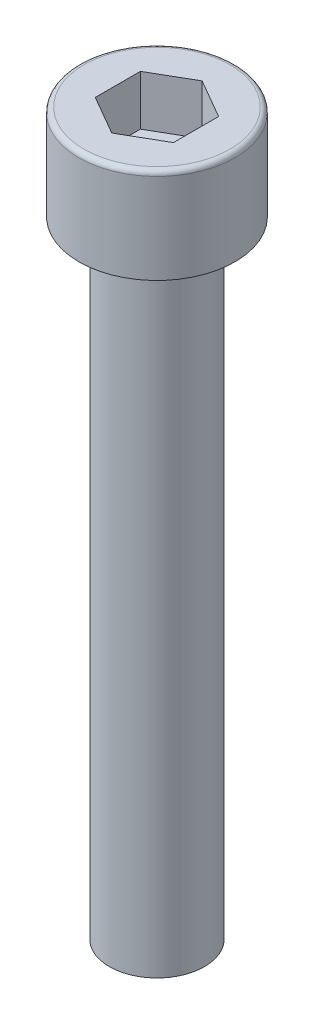
ISO-10303-21;
HEADER;
FILE_DESCRIPTION(('STEP AP214'),'2;1');
FILE_NAME('part.step','',(''),(''),'','','');
FILE_SCHEMA(('AUTOMOTIVE_DESIGN { 1 0 10303 214 1 1 1 1 }'));
ENDSEC;
DATA;
#1=APPLICATION_CONTEXT('core data for automotive mechanical design processes');
#2=APPLICATION_PROTOCOL_DEFINITION('international standard','automotive_design',2000,#1);
#3=PRODUCT_CONTEXT('',#1,'mechanical');
#4=PRODUCT('Part','Part','',(#3));
#5=PRODUCT_RELATED_PRODUCT_CATEGORY('part','',(#4));
#6=PRODUCT_DEFINITION_FORMATION('','',#4);
#7=PRODUCT_DEFINITION_CONTEXT('part definition',#1,'design');
#8=PRODUCT_DEFINITION('design','',#6,#7);
#9=PRODUCT_DEFINITION_SHAPE('','',#8);
#10=(LENGTH_UNIT() NAMED_UNIT(*) SI_UNIT(.MILLI.,.METRE.));
#11=(NAMED_UNIT(*) PLANE_ANGLE_UNIT() SI_UNIT($,.RADIAN.));
#12=(NAMED_UNIT(*) SI_UNIT($,.STERADIAN.) SOLID_ANGLE_UNIT());
#13=UNCERTAINTY_MEASURE_WITH_UNIT(LENGTH_MEASURE(1.E-05),#10,'distance_accuracy_value','');
#14=(GEOMETRIC_REPRESENTATION_CONTEXT(3) GLOBAL_UNCERTAINTY_ASSIGNED_CONTEXT((#13)) GLOBAL_UNIT_ASSIGNED_CONTEXT((#10,
#11,#12)) REPRESENTATION_CONTEXT('',''));
#15=CARTESIAN_POINT('',(0.,0.,0.));
#16=DIRECTION('',(0.,0.,1.));
#17=DIRECTION('',(1.,0.,0.));
#18=AXIS2_PLACEMENT_3D('',#15,#16,#17);
#19=CARTESIAN_POINT('',(0.,-31.75,0.));
#20=DIRECTION('',(0.,1.,0.));
#21=DIRECTION('',(0.,0.,1.));
#22=AXIS2_PLACEMENT_3D('',#19,#20,#21);
#23=CYLINDRICAL_SURFACE('',#22,2.413);
#24=CARTESIAN_POINT('',(0.,-31.75,0.));
#25=DIRECTION('',(0.,1.,0.));
#26=DIRECTION('',(0.,0.,1.));
#27=AXIS2_PLACEMENT_3D('',#24,#25,#26);
#28=CIRCLE('',#27,2.413);
#29=CARTESIAN_POINT('',(0.,-31.75,2.413));
#30=VERTEX_POINT('',#29);
#31=EDGE_CURVE('E146',#30,#30,#28,.T.);
#32=ORIENTED_EDGE('',*,*,#31,.T.);
#33=EDGE_LOOP('',(#32));
#34=FACE_BOUND('',#33,.T.);
#35=CARTESIAN_POINT('',(0.,0.,0.));
#36=DIRECTION('',(0.,1.,0.));
#37=DIRECTION('',(0.,0.,1.));
#38=AXIS2_PLACEMENT_3D('',#35,#36,#37);
#39=CIRCLE('',#38,2.413);
#40=CARTESIAN_POINT('',(0.,0.,2.413));
#41=VERTEX_POINT('',#40);
#42=EDGE_CURVE('E145',#41,#41,#39,.T.);
#43=ORIENTED_EDGE('',*,*,#42,.F.);
#44=EDGE_LOOP('',(#43));
#45=FACE_BOUND('',#44,.T.);
#46=ADVANCED_FACE('F35',(#34,#45),#23,.T.);
#47=CARTESIAN_POINT('',(0.,-31.75,0.));
#48=DIRECTION('',(0.,1.,0.));
#49=DIRECTION('',(0.,0.,1.));
#50=AXIS2_PLACEMENT_3D('',#47,#48,#49);
#51=PLANE('',#50);
#52=ORIENTED_EDGE('',*,*,#31,.F.);
#53=EDGE_LOOP('',(#52));
#54=FACE_BOUND('',#53,.T.);
#55=ADVANCED_FACE('F169',(#54),#51,.F.);
#56=CARTESIAN_POINT('',(0.,4.826,0.));
#57=DIRECTION('',(0.,-1.,0.));
#58=DIRECTION('',(0.,0.,-1.));
#59=AXIS2_PLACEMENT_3D('',#56,#57,#58);
#60=CYLINDRICAL_SURFACE('',#59,3.9624);
#61=CARTESIAN_POINT('',(0.,4.572,0.));
#62=DIRECTION('',(0.,1.,0.));
#63=DIRECTION('',(0.,0.,1.));
#64=AXIS2_PLACEMENT_3D('',#61,#62,#63);
#65=CIRCLE('',#64,3.9624);
#66=CARTESIAN_POINT('',(0.,4.572,3.9624));
#67=VERTEX_POINT('',#66);
#68=EDGE_CURVE('E11',#67,#67,#65,.F.);
#69=ORIENTED_EDGE('',*,*,#68,.T.);
#70=EDGE_LOOP('',(#69));
#71=FACE_BOUND('',#70,.T.);
#72=CARTESIAN_POINT('',(0.,0.,0.));
#73=DIRECTION('',(0.,1.,0.));
#74=DIRECTION('',(0.,0.,1.));
#75=AXIS2_PLACEMENT_3D('',#72,#73,#74);
#76=CIRCLE('',#75,3.9624);
#77=CARTESIAN_POINT('',(0.,0.,3.9624));
#78=VERTEX_POINT('',#77);
#79=EDGE_CURVE('E137',#78,#78,#76,.T.);
#80=ORIENTED_EDGE('',*,*,#79,.T.);
#81=EDGE_LOOP('',(#80));
#82=FACE_BOUND('',#81,.T.);
#83=ADVANCED_FACE('F174',(#71,#82),#60,.T.);
#84=CARTESIAN_POINT('',(0.,4.826,0.));
#85=DIRECTION('',(0.,1.,0.));
#86=DIRECTION('',(0.,0.,1.));
#87=AXIS2_PLACEMENT_3D('',#84,#85,#86);
#88=PLANE('',#87);
#89=DIRECTION('',(-0.866025403784439,0.,-0.5));
#90=VECTOR('',#89,1.);
#91=CARTESIAN_POINT('',(1.984375,4.826,-1.14567944042316));
#92=LINE('',#91,#90);
#93=CARTESIAN_POINT('',(1.984375,4.826,-1.14567944042316));
#94=VERTEX_POINT('',#93);
#95=CARTESIAN_POINT('',(0.,4.826,-2.29135888084633));
#96=VERTEX_POINT('',#95);
#97=EDGE_CURVE('E50',#94,#96,#92,.T.);
#98=ORIENTED_EDGE('',*,*,#97,.F.);
#99=DIRECTION('',(0.,0.,-1.));
#100=VECTOR('',#99,1.);
#101=CARTESIAN_POINT('',(1.984375,4.826,1.14567944042316));
#102=LINE('',#101,#100);
#103=CARTESIAN_POINT('',(1.984375,4.826,1.14567944042316));
#104=VERTEX_POINT('',#103);
#105=EDGE_CURVE('E133',#104,#94,#102,.T.);
#106=ORIENTED_EDGE('',*,*,#105,.F.);
#107=DIRECTION('',(0.866025403784439,0.,-0.5));
#108=VECTOR('',#107,1.);
#109=CARTESIAN_POINT('',(0.,4.826,2.29135888084633));
#110=LINE('',#109,#108);
#111=CARTESIAN_POINT('',(0.,4.826,2.29135888084633));
#112=VERTEX_POINT('',#111);
#113=EDGE_CURVE('E131',#112,#104,#110,.T.);
#114=ORIENTED_EDGE('',*,*,#113,.F.);
#115=DIRECTION('',(0.866025403784439,0.,0.5));
#116=VECTOR('',#115,1.);
#117=CARTESIAN_POINT('',(-1.984375,4.826,1.14567944042316));
#118=LINE('',#117,#116);
#119=CARTESIAN_POINT('',(-1.984375,4.826,1.14567944042316));
#120=VERTEX_POINT('',#119);
#121=EDGE_CURVE('E98',#120,#112,#118,.T.);
#122=ORIENTED_EDGE('',*,*,#121,.F.);
#123=DIRECTION('',(0.,0.,1.));
#124=VECTOR('',#123,1.);
#125=CARTESIAN_POINT('',(-1.984375,4.826,-1.14567944042316));
#126=LINE('',#125,#124);
#127=CARTESIAN_POINT('',(-1.984375,4.826,-1.14567944042316));
#128=VERTEX_POINT('',#127);
#129=EDGE_CURVE('E127',#128,#120,#126,.T.);
#130=ORIENTED_EDGE('',*,*,#129,.F.);
#131=DIRECTION('',(-0.866025403784439,0.,0.5));
#132=VECTOR('',#131,1.);
#133=CARTESIAN_POINT('',(0.,4.826,-2.29135888084633));
#134=LINE('',#133,#132);
#135=EDGE_CURVE('E124',#96,#128,#134,.T.);
#136=ORIENTED_EDGE('',*,*,#135,.F.);
#137=EDGE_LOOP('',(#98,#106,#114,#122,#130,#136));
#138=FACE_BOUND('',#137,.T.);
#139=CARTESIAN_POINT('',(0.,4.826,0.));
#140=DIRECTION('',(0.,1.,0.));
#141=DIRECTION('',(0.,0.,1.));
#142=AXIS2_PLACEMENT_3D('',#139,#140,#141);
#143=CIRCLE('',#142,3.7084);
#144=CARTESIAN_POINT('',(0.,4.826,3.7084));
#145=VERTEX_POINT('',#144);
#146=EDGE_CURVE('E43',#145,#145,#143,.T.);
#147=ORIENTED_EDGE('',*,*,#146,.T.);
#148=EDGE_LOOP('',(#147));
#149=FACE_BOUND('',#148,.T.);
#150=ADVANCED_FACE('F153',(#138,#149),#88,.T.);
#151=CARTESIAN_POINT('',(0.,0.,0.));
#152=DIRECTION('',(0.,1.,0.));
#153=DIRECTION('',(0.,0.,1.));
#154=AXIS2_PLACEMENT_3D('',#151,#152,#153);
#155=PLANE('',#154);
#156=ORIENTED_EDGE('',*,*,#42,.T.);
#157=EDGE_LOOP('',(#156));
#158=FACE_BOUND('',#157,.T.);
#159=ORIENTED_EDGE('',*,*,#79,.F.);
#160=EDGE_LOOP('',(#159));
#161=FACE_BOUND('',#160,.T.);
#162=ADVANCED_FACE('F157',(#158,#161),#155,.F.);
#163=CARTESIAN_POINT('',(0.,4.572,0.));
#164=DIRECTION('',(0.,1.,0.));
#165=DIRECTION('',(0.,0.,1.));
#166=AXIS2_PLACEMENT_3D('',#163,#164,#165);
#167=TOROIDAL_SURFACE('',#166,3.7084,0.254);
#168=ORIENTED_EDGE('',*,*,#68,.F.);
#169=EDGE_LOOP('',(#168));
#170=FACE_BOUND('',#169,.T.);
#171=ORIENTED_EDGE('',*,*,#146,.F.);
#172=EDGE_LOOP('',(#171));
#173=FACE_BOUND('',#172,.T.);
#174=ADVANCED_FACE('F37',(#170,#173),#167,.T.);
#175=CARTESIAN_POINT('',(1.984375,2.286,-1.14567944042316));
#176=DIRECTION('',(0.5,0.,-0.866025403784439));
#177=DIRECTION('',(-0.866025403784439,0.,-0.5));
#178=AXIS2_PLACEMENT_3D('',#175,#176,#177);
#179=PLANE('',#178);
#180=ORIENTED_EDGE('',*,*,#97,.T.);
#181=DIRECTION('',(0.,1.,0.));
#182=VECTOR('',#181,1.);
#183=CARTESIAN_POINT('',(0.,2.286,-2.29135888084633));
#184=LINE('',#183,#182);
#185=CARTESIAN_POINT('',(0.,2.286,-2.29135888084633));
#186=VERTEX_POINT('',#185);
#187=EDGE_CURVE('E80',#186,#96,#184,.T.);
#188=ORIENTED_EDGE('',*,*,#187,.F.);
#189=DIRECTION('',(-0.866025403784439,0.,-0.5));
#190=VECTOR('',#189,1.);
#191=CARTESIAN_POINT('',(1.984375,2.286,-1.14567944042316));
#192=LINE('',#191,#190);
#193=CARTESIAN_POINT('',(1.984375,2.286,-1.14567944042316));
#194=VERTEX_POINT('',#193);
#195=EDGE_CURVE('E135',#194,#186,#192,.T.);
#196=ORIENTED_EDGE('',*,*,#195,.F.);
#197=DIRECTION('',(0.,1.,0.));
#198=VECTOR('',#197,1.);
#199=CARTESIAN_POINT('',(1.984375,2.286,-1.14567944042316));
#200=LINE('',#199,#198);
#201=EDGE_CURVE('E58',#194,#94,#200,.T.);
#202=ORIENTED_EDGE('',*,*,#201,.T.);
#203=EDGE_LOOP('',(#180,#188,#196,#202));
#204=FACE_BOUND('',#203,.T.);
#205=ADVANCED_FACE('F156',(#204),#179,.F.);
#206=CARTESIAN_POINT('',(1.984375,2.286,1.14567944042316));
#207=DIRECTION('',(1.,0.,0.));
#208=DIRECTION('',(0.,0.,-1.));
#209=AXIS2_PLACEMENT_3D('',#206,#207,#208);
#210=PLANE('',#209);
#211=ORIENTED_EDGE('',*,*,#105,.T.);
#212=ORIENTED_EDGE('',*,*,#201,.F.);
#213=DIRECTION('',(0.,0.,-1.));
#214=VECTOR('',#213,1.);
#215=CARTESIAN_POINT('',(1.984375,2.286,1.14567944042316));
#216=LINE('',#215,#214);
#217=CARTESIAN_POINT('',(1.984375,2.286,1.14567944042316));
#218=VERTEX_POINT('',#217);
#219=EDGE_CURVE('E110',#218,#194,#216,.T.);
#220=ORIENTED_EDGE('',*,*,#219,.F.);
#221=DIRECTION('',(0.,1.,0.));
#222=VECTOR('',#221,1.);
#223=CARTESIAN_POINT('',(1.984375,2.286,1.14567944042316));
#224=LINE('',#223,#222);
#225=EDGE_CURVE('E102',#218,#104,#224,.T.);
#226=ORIENTED_EDGE('',*,*,#225,.T.);
#227=EDGE_LOOP('',(#211,#212,#220,#226));
#228=FACE_BOUND('',#227,.T.);
#229=ADVANCED_FACE('F163',(#228),#210,.F.);
#230=CARTESIAN_POINT('',(0.,2.286,2.29135888084633));
#231=DIRECTION('',(0.5,0.,0.866025403784439));
#232=DIRECTION('',(0.866025403784439,0.,-0.5));
#233=AXIS2_PLACEMENT_3D('',#230,#231,#232);
#234=PLANE('',#233);
#235=ORIENTED_EDGE('',*,*,#113,.T.);
#236=ORIENTED_EDGE('',*,*,#225,.F.);
#237=DIRECTION('',(0.866025403784439,0.,-0.5));
#238=VECTOR('',#237,1.);
#239=CARTESIAN_POINT('',(0.,2.286,2.29135888084633));
#240=LINE('',#239,#238);
#241=CARTESIAN_POINT('',(0.,2.286,2.29135888084633));
#242=VERTEX_POINT('',#241);
#243=EDGE_CURVE('E106',#242,#218,#240,.T.);
#244=ORIENTED_EDGE('',*,*,#243,.F.);
#245=DIRECTION('',(0.,1.,0.));
#246=VECTOR('',#245,1.);
#247=CARTESIAN_POINT('',(0.,2.286,2.29135888084633));
#248=LINE('',#247,#246);
#249=EDGE_CURVE('E91',#242,#112,#248,.T.);
#250=ORIENTED_EDGE('',*,*,#249,.T.);
#251=EDGE_LOOP('',(#235,#236,#244,#250));
#252=FACE_BOUND('',#251,.T.);
#253=ADVANCED_FACE('F107',(#252),#234,.F.);
#254=CARTESIAN_POINT('',(-1.984375,2.286,1.14567944042316));
#255=DIRECTION('',(-0.5,0.,0.866025403784439));
#256=DIRECTION('',(0.866025403784439,0.,0.5));
#257=AXIS2_PLACEMENT_3D('',#254,#255,#256);
#258=PLANE('',#257);
#259=ORIENTED_EDGE('',*,*,#121,.T.);
#260=ORIENTED_EDGE('',*,*,#249,.F.);
#261=DIRECTION('',(0.866025403784439,0.,0.5));
#262=VECTOR('',#261,1.);
#263=CARTESIAN_POINT('',(-1.984375,2.286,1.14567944042316));
#264=LINE('',#263,#262);
#265=CARTESIAN_POINT('',(-1.984375,2.286,1.14567944042316));
#266=VERTEX_POINT('',#265);
#267=EDGE_CURVE('E95',#266,#242,#264,.T.);
#268=ORIENTED_EDGE('',*,*,#267,.F.);
#269=DIRECTION('',(0.,1.,0.));
#270=VECTOR('',#269,1.);
#271=CARTESIAN_POINT('',(-1.984375,2.286,1.14567944042316));
#272=LINE('',#271,#270);
#273=EDGE_CURVE('E103',#266,#120,#272,.T.);
#274=ORIENTED_EDGE('',*,*,#273,.T.);
#275=EDGE_LOOP('',(#259,#260,#268,#274));
#276=FACE_BOUND('',#275,.T.);
#277=ADVANCED_FACE('F93',(#276),#258,.F.);
#278=CARTESIAN_POINT('',(-1.984375,2.286,-1.14567944042316));
#279=DIRECTION('',(-1.,0.,0.));
#280=DIRECTION('',(0.,0.,1.));
#281=AXIS2_PLACEMENT_3D('',#278,#279,#280);
#282=PLANE('',#281);
#283=ORIENTED_EDGE('',*,*,#129,.T.);
#284=ORIENTED_EDGE('',*,*,#273,.F.);
#285=DIRECTION('',(0.,0.,1.));
#286=VECTOR('',#285,1.);
#287=CARTESIAN_POINT('',(-1.984375,2.286,-1.14567944042316));
#288=LINE('',#287,#286);
#289=CARTESIAN_POINT('',(-1.984375,2.286,-1.14567944042316));
#290=VERTEX_POINT('',#289);
#291=EDGE_CURVE('E116',#290,#266,#288,.T.);
#292=ORIENTED_EDGE('',*,*,#291,.F.);
#293=DIRECTION('',(0.,1.,0.));
#294=VECTOR('',#293,1.);
#295=CARTESIAN_POINT('',(-1.984375,2.286,-1.14567944042316));
#296=LINE('',#295,#294);
#297=EDGE_CURVE('E140',#290,#128,#296,.T.);
#298=ORIENTED_EDGE('',*,*,#297,.T.);
#299=EDGE_LOOP('',(#283,#284,#292,#298));
#300=FACE_BOUND('',#299,.T.);
#301=ADVANCED_FACE('F188',(#300),#282,.F.);
#302=CARTESIAN_POINT('',(0.,2.286,-2.29135888084633));
#303=DIRECTION('',(-0.5,0.,-0.866025403784439));
#304=DIRECTION('',(-0.866025403784439,0.,0.5));
#305=AXIS2_PLACEMENT_3D('',#302,#303,#304);
#306=PLANE('',#305);
#307=ORIENTED_EDGE('',*,*,#135,.T.);
#308=ORIENTED_EDGE('',*,*,#297,.F.);
#309=DIRECTION('',(-0.866025403784439,0.,0.5));
#310=VECTOR('',#309,1.);
#311=CARTESIAN_POINT('',(0.,2.286,-2.29135888084633));
#312=LINE('',#311,#310);
#313=EDGE_CURVE('E118',#186,#290,#312,.T.);
#314=ORIENTED_EDGE('',*,*,#313,.F.);
#315=ORIENTED_EDGE('',*,*,#187,.T.);
#316=EDGE_LOOP('',(#307,#308,#314,#315));
#317=FACE_BOUND('',#316,.T.);
#318=ADVANCED_FACE('F185',(#317),#306,.F.);
#319=CARTESIAN_POINT('',(0.,2.286,0.));
#320=DIRECTION('',(0.,1.,0.));
#321=DIRECTION('',(0.,0.,1.));
#322=AXIS2_PLACEMENT_3D('',#319,#320,#321);
#323=PLANE('',#322);
#324=ORIENTED_EDGE('',*,*,#195,.T.);
#325=ORIENTED_EDGE('',*,*,#313,.T.);
#326=ORIENTED_EDGE('',*,*,#291,.T.);
#327=ORIENTED_EDGE('',*,*,#267,.T.);
#328=ORIENTED_EDGE('',*,*,#243,.T.);
#329=ORIENTED_EDGE('',*,*,#219,.T.);
#330=EDGE_LOOP('',(#324,#325,#326,#327,#328,#329));
#331=FACE_BOUND('',#330,.T.);
#332=ADVANCED_FACE('F113',(#331),#323,.T.);
#333=CLOSED_SHELL('',(#46,#55,#83,#150,#162,#174,#205,#229,#253,#277,#301,#318,#332));
#334=MANIFOLD_SOLID_BREP('B2',#333);
#335=ADVANCED_BREP_SHAPE_REPRESENTATION('',(#18,#334),#14);
#336=SHAPE_DEFINITION_REPRESENTATION(#9,#335);
ENDSEC;
END-ISO-10303-21;
